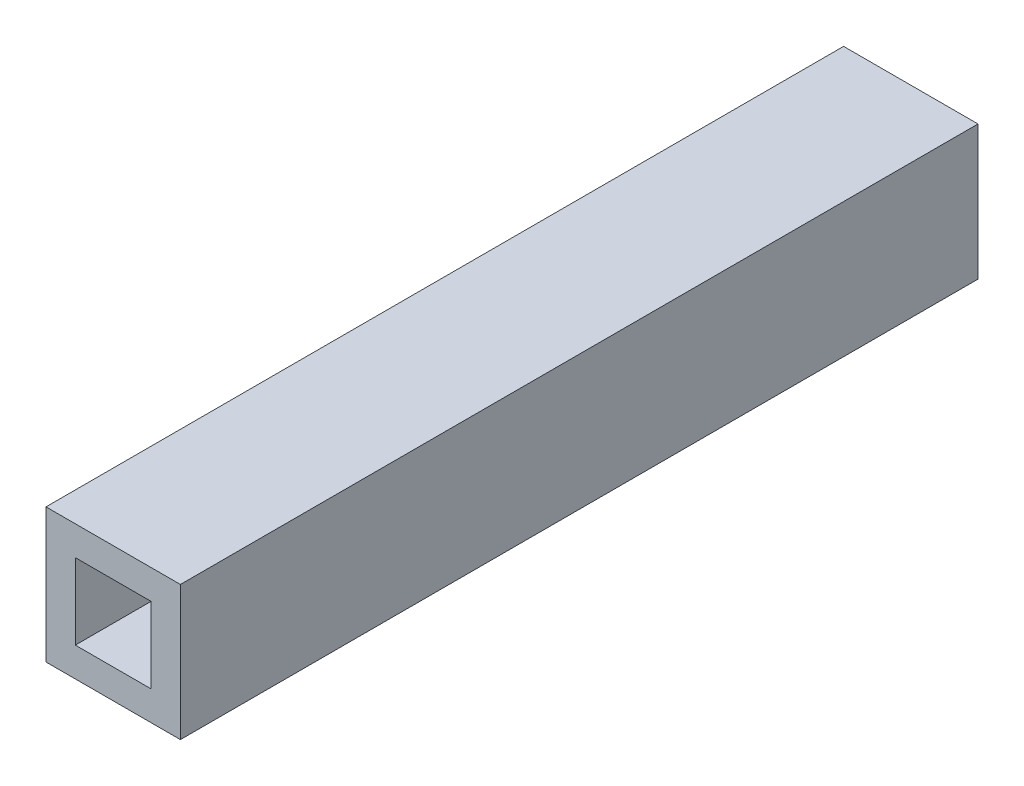
ISO-10303-21;
HEADER;
FILE_DESCRIPTION(('STEP AP214'),'2;1');
FILE_NAME('part.step','',(''),(''),'','','');
FILE_SCHEMA(('AUTOMOTIVE_DESIGN { 1 0 10303 214 1 1 1 1 }'));
ENDSEC;
DATA;
#1=APPLICATION_CONTEXT('core data for automotive mechanical design processes');
#2=APPLICATION_PROTOCOL_DEFINITION('international standard','automotive_design',2000,#1);
#3=PRODUCT_CONTEXT('',#1,'mechanical');
#4=PRODUCT('Part','Part','',(#3));
#5=PRODUCT_RELATED_PRODUCT_CATEGORY('part','',(#4));
#6=PRODUCT_DEFINITION_FORMATION('','',#4);
#7=PRODUCT_DEFINITION_CONTEXT('part definition',#1,'design');
#8=PRODUCT_DEFINITION('design','',#6,#7);
#9=PRODUCT_DEFINITION_SHAPE('','',#8);
#10=(LENGTH_UNIT() NAMED_UNIT(*) SI_UNIT(.MILLI.,.METRE.));
#11=(NAMED_UNIT(*) PLANE_ANGLE_UNIT() SI_UNIT($,.RADIAN.));
#12=(NAMED_UNIT(*) SI_UNIT($,.STERADIAN.) SOLID_ANGLE_UNIT());
#13=UNCERTAINTY_MEASURE_WITH_UNIT(LENGTH_MEASURE(1.E-05),#10,'distance_accuracy_value','');
#14=(GEOMETRIC_REPRESENTATION_CONTEXT(3) GLOBAL_UNCERTAINTY_ASSIGNED_CONTEXT((#13)) GLOBAL_UNIT_ASSIGNED_CONTEXT((#10,
#11,#12)) REPRESENTATION_CONTEXT('',''));
#15=CARTESIAN_POINT('',(0.,0.,0.));
#16=DIRECTION('',(0.,0.,1.));
#17=DIRECTION('',(1.,0.,0.));
#18=AXIS2_PLACEMENT_3D('',#15,#16,#17);
#19=CARTESIAN_POINT('',(7.73575205280388,7.43078330444527,-100.));
#20=DIRECTION('',(-1.,0.,0.));
#21=DIRECTION('',(0.,-1.,0.));
#22=AXIS2_PLACEMENT_3D('',#19,#20,#21);
#23=PLANE('',#22);
#24=DIRECTION('',(0.,-1.,0.));
#25=VECTOR('',#24,1.);
#26=CARTESIAN_POINT('',(7.73575205280388,7.43078330444527,0.));
#27=LINE('',#26,#25);
#28=CARTESIAN_POINT('',(7.73575205280388,7.43078330444527,0.));
#29=VERTEX_POINT('',#28);
#30=CARTESIAN_POINT('',(7.73575205280389,-9.41921669555473,0.));
#31=VERTEX_POINT('',#30);
#32=EDGE_CURVE('E131',#29,#31,#27,.T.);
#33=ORIENTED_EDGE('',*,*,#32,.F.);
#34=DIRECTION('',(0.,0.,1.));
#35=VECTOR('',#34,1.);
#36=CARTESIAN_POINT('',(7.73575205280388,7.43078330444527,-100.));
#37=LINE('',#36,#35);
#38=CARTESIAN_POINT('',(7.73575205280388,7.43078330444527,-100.));
#39=VERTEX_POINT('',#38);
#40=EDGE_CURVE('E11',#39,#29,#37,.T.);
#41=ORIENTED_EDGE('',*,*,#40,.F.);
#42=DIRECTION('',(0.,-1.,0.));
#43=VECTOR('',#42,1.);
#44=CARTESIAN_POINT('',(7.73575205280388,7.43078330444527,-100.));
#45=LINE('',#44,#43);
#46=CARTESIAN_POINT('',(7.73575205280389,-9.41921669555473,-100.));
#47=VERTEX_POINT('',#46);
#48=EDGE_CURVE('E135',#39,#47,#45,.T.);
#49=ORIENTED_EDGE('',*,*,#48,.T.);
#50=DIRECTION('',(0.,0.,1.));
#51=VECTOR('',#50,1.);
#52=CARTESIAN_POINT('',(7.73575205280389,-9.41921669555473,-100.));
#53=LINE('',#52,#51);
#54=EDGE_CURVE('E36',#47,#31,#53,.T.);
#55=ORIENTED_EDGE('',*,*,#54,.T.);
#56=EDGE_LOOP('',(#33,#41,#49,#55));
#57=FACE_BOUND('',#56,.T.);
#58=ADVANCED_FACE('F33',(#57),#23,.T.);
#59=CARTESIAN_POINT('',(7.73575205280388,7.43078330444527,-100.));
#60=DIRECTION('',(0.,1.,0.));
#61=DIRECTION('',(0.,0.,1.));
#62=AXIS2_PLACEMENT_3D('',#59,#60,#61);
#63=PLANE('',#62);
#64=DIRECTION('',(-1.,0.,0.));
#65=VECTOR('',#64,1.);
#66=CARTESIAN_POINT('',(7.73575205280388,7.43078330444527,0.));
#67=LINE('',#66,#65);
#68=CARTESIAN_POINT('',(24.5857520528039,7.43078330444527,0.));
#69=VERTEX_POINT('',#68);
#70=EDGE_CURVE('E139',#69,#29,#67,.T.);
#71=ORIENTED_EDGE('',*,*,#70,.F.);
#72=DIRECTION('',(0.,0.,1.));
#73=VECTOR('',#72,1.);
#74=CARTESIAN_POINT('',(24.5857520528039,7.43078330444527,-100.));
#75=LINE('',#74,#73);
#76=CARTESIAN_POINT('',(24.5857520528039,7.43078330444527,-100.));
#77=VERTEX_POINT('',#76);
#78=EDGE_CURVE('E41',#77,#69,#75,.T.);
#79=ORIENTED_EDGE('',*,*,#78,.F.);
#80=DIRECTION('',(-1.,0.,0.));
#81=VECTOR('',#80,1.);
#82=CARTESIAN_POINT('',(7.73575205280388,7.43078330444527,-100.));
#83=LINE('',#82,#81);
#84=EDGE_CURVE('E145',#77,#39,#83,.T.);
#85=ORIENTED_EDGE('',*,*,#84,.T.);
#86=ORIENTED_EDGE('',*,*,#40,.T.);
#87=EDGE_LOOP('',(#71,#79,#85,#86));
#88=FACE_BOUND('',#87,.T.);
#89=ADVANCED_FACE('F171',(#88),#63,.T.);
#90=CARTESIAN_POINT('',(24.5857520528039,7.43078330444527,-100.));
#91=DIRECTION('',(1.,0.,0.));
#92=DIRECTION('',(0.,0.,-1.));
#93=AXIS2_PLACEMENT_3D('',#90,#91,#92);
#94=PLANE('',#93);
#95=DIRECTION('',(0.,1.,0.));
#96=VECTOR('',#95,1.);
#97=CARTESIAN_POINT('',(24.5857520528039,7.43078330444527,0.));
#98=LINE('',#97,#96);
#99=CARTESIAN_POINT('',(24.5857520528039,-9.41921669555473,0.));
#100=VERTEX_POINT('',#99);
#101=EDGE_CURVE('E153',#100,#69,#98,.T.);
#102=ORIENTED_EDGE('',*,*,#101,.F.);
#103=DIRECTION('',(0.,0.,1.));
#104=VECTOR('',#103,1.);
#105=CARTESIAN_POINT('',(24.5857520528039,-9.41921669555473,-100.));
#106=LINE('',#105,#104);
#107=CARTESIAN_POINT('',(24.5857520528039,-9.41921669555473,-100.));
#108=VERTEX_POINT('',#107);
#109=EDGE_CURVE('E158',#108,#100,#106,.T.);
#110=ORIENTED_EDGE('',*,*,#109,.F.);
#111=DIRECTION('',(0.,1.,0.));
#112=VECTOR('',#111,1.);
#113=CARTESIAN_POINT('',(24.5857520528039,7.43078330444527,-100.));
#114=LINE('',#113,#112);
#115=EDGE_CURVE('E142',#108,#77,#114,.T.);
#116=ORIENTED_EDGE('',*,*,#115,.T.);
#117=ORIENTED_EDGE('',*,*,#78,.T.);
#118=EDGE_LOOP('',(#102,#110,#116,#117));
#119=FACE_BOUND('',#118,.T.);
#120=ADVANCED_FACE('F175',(#119),#94,.T.);
#121=CARTESIAN_POINT('',(7.73575205280389,-9.41921669555473,-100.));
#122=DIRECTION('',(0.,-1.,0.));
#123=DIRECTION('',(0.,0.,-1.));
#124=AXIS2_PLACEMENT_3D('',#121,#122,#123);
#125=PLANE('',#124);
#126=DIRECTION('',(1.,0.,0.));
#127=VECTOR('',#126,1.);
#128=CARTESIAN_POINT('',(7.73575205280389,-9.41921669555473,0.));
#129=LINE('',#128,#127);
#130=EDGE_CURVE('E150',#31,#100,#129,.T.);
#131=ORIENTED_EDGE('',*,*,#130,.F.);
#132=ORIENTED_EDGE('',*,*,#54,.F.);
#133=DIRECTION('',(1.,0.,0.));
#134=VECTOR('',#133,1.);
#135=CARTESIAN_POINT('',(7.73575205280389,-9.41921669555473,-100.));
#136=LINE('',#135,#134);
#137=EDGE_CURVE('E138',#47,#108,#136,.T.);
#138=ORIENTED_EDGE('',*,*,#137,.T.);
#139=ORIENTED_EDGE('',*,*,#109,.T.);
#140=EDGE_LOOP('',(#131,#132,#138,#139));
#141=FACE_BOUND('',#140,.T.);
#142=ADVANCED_FACE('F166',(#141),#125,.T.);
#143=CARTESIAN_POINT('',(7.73575205280389,-9.41921669555473,-100.));
#144=DIRECTION('',(0.,0.,1.));
#145=DIRECTION('',(1.,0.,0.));
#146=AXIS2_PLACEMENT_3D('',#143,#144,#145);
#147=PLANE('',#146);
#148=DIRECTION('',(-1.,0.,0.));
#149=VECTOR('',#148,1.);
#150=CARTESIAN_POINT('',(11.4107520528039,3.75578330444527,-100.));
#151=LINE('',#150,#149);
#152=CARTESIAN_POINT('',(20.9107520528039,3.75578330444527,-100.));
#153=VERTEX_POINT('',#152);
#154=CARTESIAN_POINT('',(11.4107520528039,3.75578330444527,-100.));
#155=VERTEX_POINT('',#154);
#156=EDGE_CURVE('E106',#153,#155,#151,.T.);
#157=ORIENTED_EDGE('',*,*,#156,.T.);
#158=DIRECTION('',(0.,-1.,0.));
#159=VECTOR('',#158,1.);
#160=CARTESIAN_POINT('',(11.4107520528039,3.75578330444527,-100.));
#161=LINE('',#160,#159);
#162=CARTESIAN_POINT('',(11.4107520528039,-5.74421669555473,-100.));
#163=VERTEX_POINT('',#162);
#164=EDGE_CURVE('E100',#155,#163,#161,.T.);
#165=ORIENTED_EDGE('',*,*,#164,.T.);
#166=DIRECTION('',(1.,0.,0.));
#167=VECTOR('',#166,1.);
#168=CARTESIAN_POINT('',(11.4107520528039,-5.74421669555473,-100.));
#169=LINE('',#168,#167);
#170=CARTESIAN_POINT('',(20.9107520528039,-5.74421669555473,-100.));
#171=VERTEX_POINT('',#170);
#172=EDGE_CURVE('E109',#163,#171,#169,.T.);
#173=ORIENTED_EDGE('',*,*,#172,.T.);
#174=DIRECTION('',(0.,1.,0.));
#175=VECTOR('',#174,1.);
#176=CARTESIAN_POINT('',(20.9107520528039,3.75578330444527,-100.));
#177=LINE('',#176,#175);
#178=EDGE_CURVE('E49',#171,#153,#177,.T.);
#179=ORIENTED_EDGE('',*,*,#178,.T.);
#180=EDGE_LOOP('',(#157,#165,#173,#179));
#181=FACE_BOUND('',#180,.T.);
#182=ORIENTED_EDGE('',*,*,#48,.F.);
#183=ORIENTED_EDGE('',*,*,#84,.F.);
#184=ORIENTED_EDGE('',*,*,#115,.F.);
#185=ORIENTED_EDGE('',*,*,#137,.F.);
#186=EDGE_LOOP('',(#182,#183,#184,#185));
#187=FACE_BOUND('',#186,.T.);
#188=ADVANCED_FACE('F113',(#181,#187),#147,.F.);
#189=CARTESIAN_POINT('',(7.73575205280389,-9.41921669555473,0.));
#190=DIRECTION('',(0.,0.,1.));
#191=DIRECTION('',(1.,0.,0.));
#192=AXIS2_PLACEMENT_3D('',#189,#190,#191);
#193=PLANE('',#192);
#194=DIRECTION('',(0.,-1.,0.));
#195=VECTOR('',#194,1.);
#196=CARTESIAN_POINT('',(11.4107520528039,3.75578330444527,0.));
#197=LINE('',#196,#195);
#198=CARTESIAN_POINT('',(11.4107520528039,3.75578330444527,0.));
#199=VERTEX_POINT('',#198);
#200=CARTESIAN_POINT('',(11.4107520528039,-5.74421669555473,0.));
#201=VERTEX_POINT('',#200);
#202=EDGE_CURVE('E57',#199,#201,#197,.T.);
#203=ORIENTED_EDGE('',*,*,#202,.F.);
#204=DIRECTION('',(-1.,0.,0.));
#205=VECTOR('',#204,1.);
#206=CARTESIAN_POINT('',(11.4107520528039,3.75578330444527,0.));
#207=LINE('',#206,#205);
#208=CARTESIAN_POINT('',(20.9107520528039,3.75578330444527,0.));
#209=VERTEX_POINT('',#208);
#210=EDGE_CURVE('E116',#209,#199,#207,.T.);
#211=ORIENTED_EDGE('',*,*,#210,.F.);
#212=DIRECTION('',(0.,1.,0.));
#213=VECTOR('',#212,1.);
#214=CARTESIAN_POINT('',(20.9107520528039,3.75578330444527,0.));
#215=LINE('',#214,#213);
#216=CARTESIAN_POINT('',(20.9107520528039,-5.74421669555473,0.));
#217=VERTEX_POINT('',#216);
#218=EDGE_CURVE('E119',#217,#209,#215,.T.);
#219=ORIENTED_EDGE('',*,*,#218,.F.);
#220=DIRECTION('',(1.,0.,0.));
#221=VECTOR('',#220,1.);
#222=CARTESIAN_POINT('',(11.4107520528039,-5.74421669555473,0.));
#223=LINE('',#222,#221);
#224=EDGE_CURVE('E125',#201,#217,#223,.T.);
#225=ORIENTED_EDGE('',*,*,#224,.F.);
#226=EDGE_LOOP('',(#203,#211,#219,#225));
#227=FACE_BOUND('',#226,.T.);
#228=ORIENTED_EDGE('',*,*,#32,.T.);
#229=ORIENTED_EDGE('',*,*,#130,.T.);
#230=ORIENTED_EDGE('',*,*,#101,.T.);
#231=ORIENTED_EDGE('',*,*,#70,.T.);
#232=EDGE_LOOP('',(#228,#229,#230,#231));
#233=FACE_BOUND('',#232,.T.);
#234=ADVANCED_FACE('F168',(#227,#233),#193,.T.);
#235=CARTESIAN_POINT('',(11.4107520528039,3.75578330444527,-100.));
#236=DIRECTION('',(-1.,0.,0.));
#237=DIRECTION('',(0.,0.,1.));
#238=AXIS2_PLACEMENT_3D('',#235,#236,#237);
#239=PLANE('',#238);
#240=ORIENTED_EDGE('',*,*,#202,.T.);
#241=DIRECTION('',(0.,0.,1.));
#242=VECTOR('',#241,1.);
#243=CARTESIAN_POINT('',(11.4107520528039,-5.74421669555473,-100.));
#244=LINE('',#243,#242);
#245=EDGE_CURVE('E96',#163,#201,#244,.T.);
#246=ORIENTED_EDGE('',*,*,#245,.F.);
#247=ORIENTED_EDGE('',*,*,#164,.F.);
#248=DIRECTION('',(0.,0.,1.));
#249=VECTOR('',#248,1.);
#250=CARTESIAN_POINT('',(11.4107520528039,3.75578330444527,-100.));
#251=LINE('',#250,#249);
#252=EDGE_CURVE('E129',#155,#199,#251,.T.);
#253=ORIENTED_EDGE('',*,*,#252,.T.);
#254=EDGE_LOOP('',(#240,#246,#247,#253));
#255=FACE_BOUND('',#254,.T.);
#256=ADVANCED_FACE('F98',(#255),#239,.F.);
#257=CARTESIAN_POINT('',(11.4107520528039,3.75578330444527,-100.));
#258=DIRECTION('',(0.,1.,0.));
#259=DIRECTION('',(-1.,0.,0.));
#260=AXIS2_PLACEMENT_3D('',#257,#258,#259);
#261=PLANE('',#260);
#262=ORIENTED_EDGE('',*,*,#210,.T.);
#263=ORIENTED_EDGE('',*,*,#252,.F.);
#264=ORIENTED_EDGE('',*,*,#156,.F.);
#265=DIRECTION('',(0.,0.,1.));
#266=VECTOR('',#265,1.);
#267=CARTESIAN_POINT('',(20.9107520528039,3.75578330444527,-100.));
#268=LINE('',#267,#266);
#269=EDGE_CURVE('E132',#153,#209,#268,.T.);
#270=ORIENTED_EDGE('',*,*,#269,.T.);
#271=EDGE_LOOP('',(#262,#263,#264,#270));
#272=FACE_BOUND('',#271,.T.);
#273=ADVANCED_FACE('F226',(#272),#261,.F.);
#274=CARTESIAN_POINT('',(20.9107520528039,3.75578330444527,-100.));
#275=DIRECTION('',(1.,0.,0.));
#276=DIRECTION('',(0.,0.,-1.));
#277=AXIS2_PLACEMENT_3D('',#274,#275,#276);
#278=PLANE('',#277);
#279=ORIENTED_EDGE('',*,*,#218,.T.);
#280=ORIENTED_EDGE('',*,*,#269,.F.);
#281=ORIENTED_EDGE('',*,*,#178,.F.);
#282=DIRECTION('',(0.,0.,1.));
#283=VECTOR('',#282,1.);
#284=CARTESIAN_POINT('',(20.9107520528039,-5.74421669555473,-100.));
#285=LINE('',#284,#283);
#286=EDGE_CURVE('E105',#171,#217,#285,.T.);
#287=ORIENTED_EDGE('',*,*,#286,.T.);
#288=EDGE_LOOP('',(#279,#280,#281,#287));
#289=FACE_BOUND('',#288,.T.);
#290=ADVANCED_FACE('F235',(#289),#278,.F.);
#291=CARTESIAN_POINT('',(11.4107520528039,-5.74421669555473,-100.));
#292=DIRECTION('',(0.,-1.,0.));
#293=DIRECTION('',(1.,0.,0.));
#294=AXIS2_PLACEMENT_3D('',#291,#292,#293);
#295=PLANE('',#294);
#296=ORIENTED_EDGE('',*,*,#224,.T.);
#297=ORIENTED_EDGE('',*,*,#286,.F.);
#298=ORIENTED_EDGE('',*,*,#172,.F.);
#299=ORIENTED_EDGE('',*,*,#245,.T.);
#300=EDGE_LOOP('',(#296,#297,#298,#299));
#301=FACE_BOUND('',#300,.T.);
#302=ADVANCED_FACE('F110',(#301),#295,.F.);
#303=CLOSED_SHELL('',(#58,#89,#120,#142,#188,#234,#256,#273,#290,#302));
#304=MANIFOLD_SOLID_BREP('B2',#303);
#305=ADVANCED_BREP_SHAPE_REPRESENTATION('',(#18,#304),#14);
#306=SHAPE_DEFINITION_REPRESENTATION(#9,#305);
ENDSEC;
END-ISO-10303-21;
